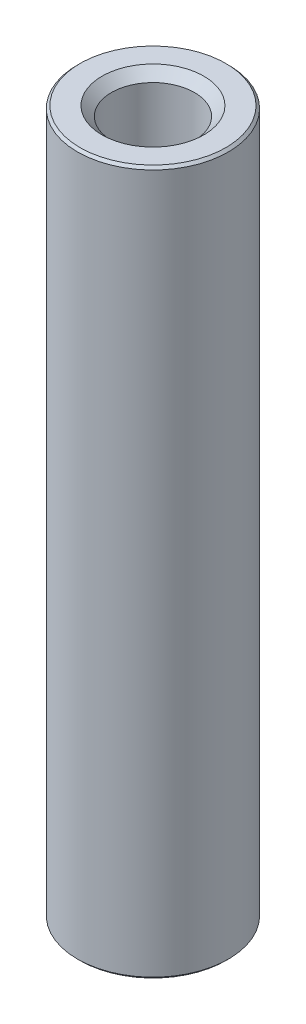
ISO-10303-21;
HEADER;
FILE_DESCRIPTION(('STEP AP214'),'2;1');
FILE_NAME('part.step','',(''),(''),'','','');
FILE_SCHEMA(('AUTOMOTIVE_DESIGN { 1 0 10303 214 1 1 1 1 }'));
ENDSEC;
DATA;
#1=APPLICATION_CONTEXT('core data for automotive mechanical design processes');
#2=APPLICATION_PROTOCOL_DEFINITION('international standard','automotive_design',2000,#1);
#3=PRODUCT_CONTEXT('',#1,'mechanical');
#4=PRODUCT('Part','Part','',(#3));
#5=PRODUCT_RELATED_PRODUCT_CATEGORY('part','',(#4));
#6=PRODUCT_DEFINITION_FORMATION('','',#4);
#7=PRODUCT_DEFINITION_CONTEXT('part definition',#1,'design');
#8=PRODUCT_DEFINITION('design','',#6,#7);
#9=PRODUCT_DEFINITION_SHAPE('','',#8);
#10=(LENGTH_UNIT() NAMED_UNIT(*) SI_UNIT(.MILLI.,.METRE.));
#11=(NAMED_UNIT(*) PLANE_ANGLE_UNIT() SI_UNIT($,.RADIAN.));
#12=(NAMED_UNIT(*) SI_UNIT($,.STERADIAN.) SOLID_ANGLE_UNIT());
#13=UNCERTAINTY_MEASURE_WITH_UNIT(LENGTH_MEASURE(1.E-05),#10,'distance_accuracy_value','');
#14=(GEOMETRIC_REPRESENTATION_CONTEXT(3) GLOBAL_UNCERTAINTY_ASSIGNED_CONTEXT((#13)) GLOBAL_UNIT_ASSIGNED_CONTEXT((#10,
#11,#12)) REPRESENTATION_CONTEXT('',''));
#15=CARTESIAN_POINT('',(0.,0.,0.));
#16=DIRECTION('',(0.,0.,1.));
#17=DIRECTION('',(1.,0.,0.));
#18=AXIS2_PLACEMENT_3D('',#15,#16,#17);
#19=CARTESIAN_POINT('',(0.,14.,0.));
#20=DIRECTION('',(0.,-1.,0.));
#21=DIRECTION('',(0.,0.,-1.));
#22=AXIS2_PLACEMENT_3D('',#19,#20,#21);
#23=CYLINDRICAL_SURFACE('',#22,3.);
#24=CARTESIAN_POINT('',(0.,-13.9,0.));
#25=DIRECTION('',(0.,1.,0.));
#26=DIRECTION('',(0.,0.,1.));
#27=AXIS2_PLACEMENT_3D('',#24,#25,#26);
#28=CIRCLE('',#27,3.);
#29=CARTESIAN_POINT('',(0.,-13.9,3.));
#30=VERTEX_POINT('',#29);
#31=EDGE_CURVE('E59',#30,#30,#28,.T.);
#32=ORIENTED_EDGE('',*,*,#31,.T.);
#33=EDGE_LOOP('',(#32));
#34=FACE_BOUND('',#33,.T.);
#35=CARTESIAN_POINT('',(0.,13.9,0.));
#36=DIRECTION('',(0.,1.,0.));
#37=DIRECTION('',(0.,0.,1.));
#38=AXIS2_PLACEMENT_3D('',#35,#36,#37);
#39=CIRCLE('',#38,3.);
#40=CARTESIAN_POINT('',(0.,13.9,3.));
#41=VERTEX_POINT('',#40);
#42=EDGE_CURVE('E63',#41,#41,#39,.F.);
#43=ORIENTED_EDGE('',*,*,#42,.T.);
#44=EDGE_LOOP('',(#43));
#45=FACE_BOUND('',#44,.T.);
#46=ADVANCED_FACE('F47',(#34,#45),#23,.T.);
#47=CARTESIAN_POINT('',(0.,14.,0.));
#48=DIRECTION('',(0.,1.,0.));
#49=DIRECTION('',(0.,0.,1.));
#50=AXIS2_PLACEMENT_3D('',#47,#48,#49);
#51=PLANE('',#50);
#52=CARTESIAN_POINT('',(0.,14.,0.));
#53=DIRECTION('',(0.,1.,0.));
#54=DIRECTION('',(0.,0.,1.));
#55=AXIS2_PLACEMENT_3D('',#52,#53,#54);
#56=CIRCLE('',#55,2.9);
#57=CARTESIAN_POINT('',(0.,14.,2.9));
#58=VERTEX_POINT('',#57);
#59=EDGE_CURVE('E10',#58,#58,#56,.T.);
#60=ORIENTED_EDGE('',*,*,#59,.T.);
#61=EDGE_LOOP('',(#60));
#62=FACE_BOUND('',#61,.T.);
#63=CARTESIAN_POINT('',(0.,14.,0.));
#64=DIRECTION('',(0.,1.,0.));
#65=DIRECTION('',(0.,0.,1.));
#66=AXIS2_PLACEMENT_3D('',#63,#64,#65);
#67=CIRCLE('',#66,2.025);
#68=CARTESIAN_POINT('',(0.,14.,2.025));
#69=VERTEX_POINT('',#68);
#70=EDGE_CURVE('E74',#69,#69,#67,.T.);
#71=ORIENTED_EDGE('',*,*,#70,.F.);
#72=EDGE_LOOP('',(#71));
#73=FACE_BOUND('',#72,.T.);
#74=ADVANCED_FACE('F102',(#62,#73),#51,.T.);
#75=CARTESIAN_POINT('',(0.,-14.,0.));
#76=DIRECTION('',(0.,1.,0.));
#77=DIRECTION('',(0.,0.,1.));
#78=AXIS2_PLACEMENT_3D('',#75,#76,#77);
#79=PLANE('',#78);
#80=CARTESIAN_POINT('',(0.,-14.,0.));
#81=DIRECTION('',(0.,1.,0.));
#82=DIRECTION('',(0.,0.,1.));
#83=AXIS2_PLACEMENT_3D('',#80,#81,#82);
#84=CIRCLE('',#83,2.9);
#85=CARTESIAN_POINT('',(0.,-14.,2.9));
#86=VERTEX_POINT('',#85);
#87=EDGE_CURVE('E55',#86,#86,#84,.F.);
#88=ORIENTED_EDGE('',*,*,#87,.T.);
#89=EDGE_LOOP('',(#88));
#90=FACE_BOUND('',#89,.T.);
#91=CARTESIAN_POINT('',(0.,-14.,0.));
#92=DIRECTION('',(0.,1.,0.));
#93=DIRECTION('',(0.,0.,1.));
#94=AXIS2_PLACEMENT_3D('',#91,#92,#93);
#95=CIRCLE('',#94,1.67499999999999);
#96=CARTESIAN_POINT('',(0.,-14.,1.67499999999999));
#97=VERTEX_POINT('',#96);
#98=EDGE_CURVE('E77',#97,#97,#95,.T.);
#99=ORIENTED_EDGE('',*,*,#98,.T.);
#100=EDGE_LOOP('',(#99));
#101=FACE_BOUND('',#100,.T.);
#102=ADVANCED_FACE('F81',(#90,#101),#79,.F.);
#103=CARTESIAN_POINT('',(0.,-13.975,0.));
#104=DIRECTION('',(0.,-1.,0.));
#105=DIRECTION('',(0.,0.,-1.));
#106=AXIS2_PLACEMENT_3D('',#103,#104,#105);
#107=CONICAL_SURFACE('',#106,1.65,0.785398163397396);
#108=ORIENTED_EDGE('',*,*,#98,.F.);
#109=EDGE_LOOP('',(#108));
#110=FACE_BOUND('',#109,.T.);
#111=CARTESIAN_POINT('',(0.,-13.975,0.));
#112=DIRECTION('',(0.,1.,0.));
#113=DIRECTION('',(0.,0.,1.));
#114=AXIS2_PLACEMENT_3D('',#111,#112,#113);
#115=CIRCLE('',#114,1.65);
#116=CARTESIAN_POINT('',(0.,-13.975,1.65));
#117=VERTEX_POINT('',#116);
#118=EDGE_CURVE('E68',#117,#117,#115,.T.);
#119=ORIENTED_EDGE('',*,*,#118,.T.);
#120=EDGE_LOOP('',(#119));
#121=FACE_BOUND('',#120,.T.);
#122=ADVANCED_FACE('F83',(#110,#121),#107,.F.);
#123=CARTESIAN_POINT('',(0.,14.,0.));
#124=DIRECTION('',(0.,1.,0.));
#125=DIRECTION('',(0.,0.,1.));
#126=AXIS2_PLACEMENT_3D('',#123,#124,#125);
#127=CYLINDRICAL_SURFACE('',#126,1.65);
#128=ORIENTED_EDGE('',*,*,#118,.F.);
#129=EDGE_LOOP('',(#128));
#130=FACE_BOUND('',#129,.T.);
#131=CARTESIAN_POINT('',(0.,13.625,0.));
#132=DIRECTION('',(0.,1.,0.));
#133=DIRECTION('',(0.,0.,1.));
#134=AXIS2_PLACEMENT_3D('',#131,#132,#133);
#135=CIRCLE('',#134,1.65);
#136=CARTESIAN_POINT('',(0.,13.625,1.65));
#137=VERTEX_POINT('',#136);
#138=EDGE_CURVE('E71',#137,#137,#135,.T.);
#139=ORIENTED_EDGE('',*,*,#138,.T.);
#140=EDGE_LOOP('',(#139));
#141=FACE_BOUND('',#140,.T.);
#142=ADVANCED_FACE('F86',(#130,#141),#127,.F.);
#143=CARTESIAN_POINT('',(0.,14.,0.));
#144=DIRECTION('',(0.,1.,0.));
#145=DIRECTION('',(0.,0.,1.));
#146=AXIS2_PLACEMENT_3D('',#143,#144,#145);
#147=CONICAL_SURFACE('',#146,2.025,0.785398163397447);
#148=ORIENTED_EDGE('',*,*,#138,.F.);
#149=EDGE_LOOP('',(#148));
#150=FACE_BOUND('',#149,.T.);
#151=ORIENTED_EDGE('',*,*,#70,.T.);
#152=EDGE_LOOP('',(#151));
#153=FACE_BOUND('',#152,.T.);
#154=ADVANCED_FACE('F92',(#150,#153),#147,.F.);
#155=CARTESIAN_POINT('',(0.,-13.9,0.));
#156=DIRECTION('',(0.,1.,0.));
#157=DIRECTION('',(0.,0.,1.));
#158=AXIS2_PLACEMENT_3D('',#155,#156,#157);
#159=CONICAL_SURFACE('',#158,3.,0.785398163397455);
#160=ORIENTED_EDGE('',*,*,#87,.F.);
#161=EDGE_LOOP('',(#160));
#162=FACE_BOUND('',#161,.T.);
#163=ORIENTED_EDGE('',*,*,#31,.F.);
#164=EDGE_LOOP('',(#163));
#165=FACE_BOUND('',#164,.T.);
#166=ADVANCED_FACE('F98',(#162,#165),#159,.T.);
#167=CARTESIAN_POINT('',(0.,14.,0.));
#168=DIRECTION('',(0.,-1.,0.));
#169=DIRECTION('',(0.,0.,-1.));
#170=AXIS2_PLACEMENT_3D('',#167,#168,#169);
#171=CONICAL_SURFACE('',#170,2.9,0.785398163397448);
#172=ORIENTED_EDGE('',*,*,#42,.F.);
#173=EDGE_LOOP('',(#172));
#174=FACE_BOUND('',#173,.T.);
#175=ORIENTED_EDGE('',*,*,#59,.F.);
#176=EDGE_LOOP('',(#175));
#177=FACE_BOUND('',#176,.T.);
#178=ADVANCED_FACE('F50',(#174,#177),#171,.T.);
#179=CLOSED_SHELL('',(#46,#74,#102,#122,#142,#154,#166,#178));
#180=MANIFOLD_SOLID_BREP('B2',#179);
#181=ADVANCED_BREP_SHAPE_REPRESENTATION('',(#18,#180),#14);
#182=SHAPE_DEFINITION_REPRESENTATION(#9,#181);
ENDSEC;
END-ISO-10303-21;
